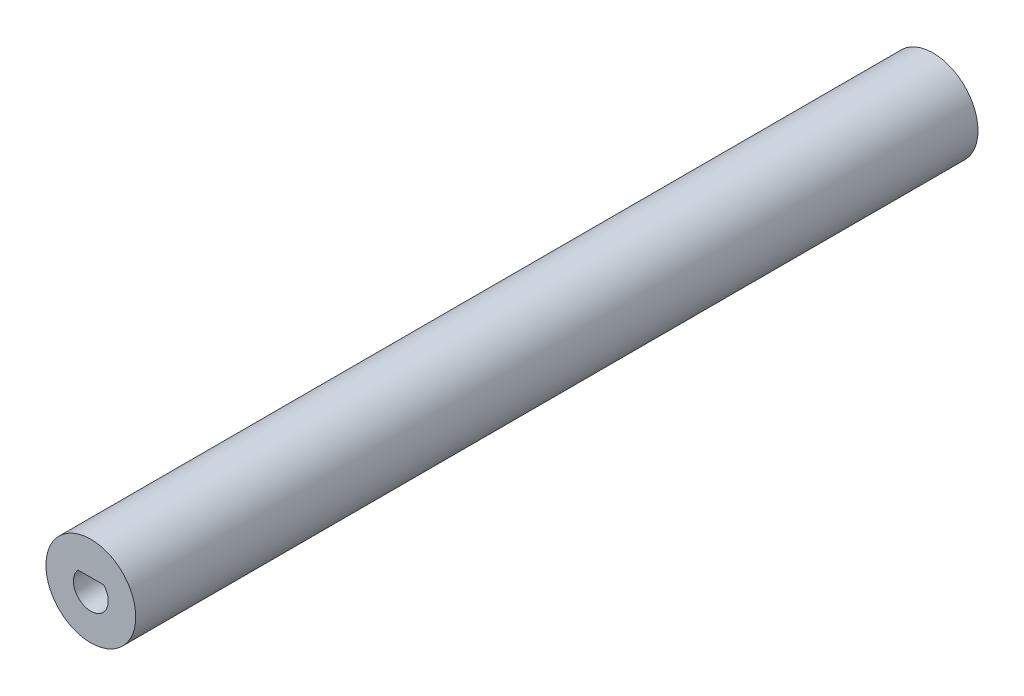
ISO-10303-21;
HEADER;
FILE_DESCRIPTION(('STEP AP214'),'2;1');
FILE_NAME('part.step','',(''),(''),'','','');
FILE_SCHEMA(('AUTOMOTIVE_DESIGN { 1 0 10303 214 1 1 1 1 }'));
ENDSEC;
DATA;
#1=APPLICATION_CONTEXT('core data for automotive mechanical design processes');
#2=APPLICATION_PROTOCOL_DEFINITION('international standard','automotive_design',2000,#1);
#3=PRODUCT_CONTEXT('',#1,'mechanical');
#4=PRODUCT('Part','Part','',(#3));
#5=PRODUCT_RELATED_PRODUCT_CATEGORY('part','',(#4));
#6=PRODUCT_DEFINITION_FORMATION('','',#4);
#7=PRODUCT_DEFINITION_CONTEXT('part definition',#1,'design');
#8=PRODUCT_DEFINITION('design','',#6,#7);
#9=PRODUCT_DEFINITION_SHAPE('','',#8);
#10=(LENGTH_UNIT() NAMED_UNIT(*) SI_UNIT(.MILLI.,.METRE.));
#11=(NAMED_UNIT(*) PLANE_ANGLE_UNIT() SI_UNIT($,.RADIAN.));
#12=(NAMED_UNIT(*) SI_UNIT($,.STERADIAN.) SOLID_ANGLE_UNIT());
#13=UNCERTAINTY_MEASURE_WITH_UNIT(LENGTH_MEASURE(1.E-05),#10,'distance_accuracy_value','');
#14=(GEOMETRIC_REPRESENTATION_CONTEXT(3) GLOBAL_UNCERTAINTY_ASSIGNED_CONTEXT((#13)) GLOBAL_UNIT_ASSIGNED_CONTEXT((#10,
#11,#12)) REPRESENTATION_CONTEXT('',''));
#15=CARTESIAN_POINT('',(0.,0.,0.));
#16=DIRECTION('',(0.,0.,1.));
#17=DIRECTION('',(1.,0.,0.));
#18=AXIS2_PLACEMENT_3D('',#15,#16,#17);
#19=CARTESIAN_POINT('',(0.,0.,75.));
#20=DIRECTION('',(0.,0.,-1.));
#21=DIRECTION('',(-1.,0.,0.));
#22=AXIS2_PLACEMENT_3D('',#19,#20,#21);
#23=CYLINDRICAL_SURFACE('',#22,4.);
#24=CARTESIAN_POINT('',(0.,0.,75.));
#25=DIRECTION('',(0.,0.,1.));
#26=DIRECTION('',(1.,0.,0.));
#27=AXIS2_PLACEMENT_3D('',#24,#25,#26);
#28=CIRCLE('',#27,4.);
#29=CARTESIAN_POINT('',(4.,0.,75.));
#30=VERTEX_POINT('',#29);
#31=EDGE_CURVE('E85',#30,#30,#28,.T.);
#32=ORIENTED_EDGE('',*,*,#31,.F.);
#33=EDGE_LOOP('',(#32));
#34=FACE_BOUND('',#33,.T.);
#35=CARTESIAN_POINT('',(0.,0.,0.));
#36=DIRECTION('',(0.,0.,1.));
#37=DIRECTION('',(1.,0.,0.));
#38=AXIS2_PLACEMENT_3D('',#35,#36,#37);
#39=CIRCLE('',#38,4.);
#40=CARTESIAN_POINT('',(4.,0.,0.));
#41=VERTEX_POINT('',#40);
#42=EDGE_CURVE('E69',#41,#41,#39,.T.);
#43=ORIENTED_EDGE('',*,*,#42,.T.);
#44=EDGE_LOOP('',(#43));
#45=FACE_BOUND('',#44,.T.);
#46=ADVANCED_FACE('F39',(#34,#45),#23,.T.);
#47=CARTESIAN_POINT('',(0.,0.,75.));
#48=DIRECTION('',(0.,0.,1.));
#49=DIRECTION('',(1.,0.,0.));
#50=AXIS2_PLACEMENT_3D('',#47,#48,#49);
#51=PLANE('',#50);
#52=CARTESIAN_POINT('',(0.,0.,75.));
#53=DIRECTION('',(0.,0.,1.));
#54=DIRECTION('',(1.,0.,0.));
#55=AXIS2_PLACEMENT_3D('',#52,#53,#54);
#56=CIRCLE('',#55,1.55);
#57=CARTESIAN_POINT('',(-1.14017542509914,1.05,75.));
#58=VERTEX_POINT('',#57);
#59=CARTESIAN_POINT('',(1.14017542509914,1.05,75.));
#60=VERTEX_POINT('',#59);
#61=EDGE_CURVE('E54',#58,#60,#56,.T.);
#62=ORIENTED_EDGE('',*,*,#61,.F.);
#63=DIRECTION('',(-1.,0.,0.));
#64=VECTOR('',#63,1.);
#65=CARTESIAN_POINT('',(-1.14017542509914,1.05,75.));
#66=LINE('',#65,#64);
#67=EDGE_CURVE('E73',#60,#58,#66,.T.);
#68=ORIENTED_EDGE('',*,*,#67,.F.);
#69=EDGE_LOOP('',(#62,#68));
#70=FACE_BOUND('',#69,.T.);
#71=ORIENTED_EDGE('',*,*,#31,.T.);
#72=EDGE_LOOP('',(#71));
#73=FACE_BOUND('',#72,.T.);
#74=ADVANCED_FACE('F78',(#70,#73),#51,.T.);
#75=CARTESIAN_POINT('',(0.,0.,0.));
#76=DIRECTION('',(0.,0.,1.));
#77=DIRECTION('',(1.,0.,0.));
#78=AXIS2_PLACEMENT_3D('',#75,#76,#77);
#79=PLANE('',#78);
#80=DIRECTION('',(-1.,0.,0.));
#81=VECTOR('',#80,1.);
#82=CARTESIAN_POINT('',(0.,1.05,0.));
#83=LINE('',#82,#81);
#84=CARTESIAN_POINT('',(1.14017542509914,1.05,0.));
#85=VERTEX_POINT('',#84);
#86=CARTESIAN_POINT('',(-1.14017542509914,1.05,0.));
#87=VERTEX_POINT('',#86);
#88=EDGE_CURVE('E47',#85,#87,#83,.T.);
#89=ORIENTED_EDGE('',*,*,#88,.T.);
#90=CARTESIAN_POINT('',(0.,0.,0.));
#91=DIRECTION('',(0.,0.,1.));
#92=DIRECTION('',(1.,0.,0.));
#93=AXIS2_PLACEMENT_3D('',#90,#91,#92);
#94=CIRCLE('',#93,1.55);
#95=EDGE_CURVE('E11',#87,#85,#94,.T.);
#96=ORIENTED_EDGE('',*,*,#95,.T.);
#97=EDGE_LOOP('',(#89,#96));
#98=FACE_BOUND('',#97,.T.);
#99=ORIENTED_EDGE('',*,*,#42,.F.);
#100=EDGE_LOOP('',(#99));
#101=FACE_BOUND('',#100,.T.);
#102=ADVANCED_FACE('F93',(#98,#101),#79,.F.);
#103=CARTESIAN_POINT('',(0.,0.,-29.));
#104=DIRECTION('',(0.,0.,1.));
#105=DIRECTION('',(1.,0.,0.));
#106=AXIS2_PLACEMENT_3D('',#103,#104,#105);
#107=CYLINDRICAL_SURFACE('',#106,1.55);
#108=DIRECTION('',(0.,0.,1.));
#109=VECTOR('',#108,1.);
#110=CARTESIAN_POINT('',(-1.14017542509914,1.05,-29.));
#111=LINE('',#110,#109);
#112=EDGE_CURVE('E61',#87,#58,#111,.T.);
#113=ORIENTED_EDGE('',*,*,#112,.T.);
#114=ORIENTED_EDGE('',*,*,#61,.T.);
#115=DIRECTION('',(0.,0.,1.));
#116=VECTOR('',#115,1.);
#117=CARTESIAN_POINT('',(1.14017542509914,1.05,-29.));
#118=LINE('',#117,#116);
#119=EDGE_CURVE('E70',#85,#60,#118,.T.);
#120=ORIENTED_EDGE('',*,*,#119,.F.);
#121=ORIENTED_EDGE('',*,*,#95,.F.);
#122=EDGE_LOOP('',(#113,#114,#120,#121));
#123=FACE_BOUND('',#122,.T.);
#124=ADVANCED_FACE('F66',(#123),#107,.F.);
#125=CARTESIAN_POINT('',(-1.14017542509914,1.05,-29.));
#126=DIRECTION('',(0.,1.,0.));
#127=DIRECTION('',(0.,0.,1.));
#128=AXIS2_PLACEMENT_3D('',#125,#126,#127);
#129=PLANE('',#128);
#130=ORIENTED_EDGE('',*,*,#119,.T.);
#131=ORIENTED_EDGE('',*,*,#67,.T.);
#132=ORIENTED_EDGE('',*,*,#112,.F.);
#133=ORIENTED_EDGE('',*,*,#88,.F.);
#134=EDGE_LOOP('',(#130,#131,#132,#133));
#135=FACE_BOUND('',#134,.T.);
#136=ADVANCED_FACE('F74',(#135),#129,.F.);
#137=CLOSED_SHELL('',(#46,#74,#102,#124,#136));
#138=MANIFOLD_SOLID_BREP('B2',#137);
#139=ADVANCED_BREP_SHAPE_REPRESENTATION('',(#18,#138),#14);
#140=SHAPE_DEFINITION_REPRESENTATION(#9,#139);
ENDSEC;
END-ISO-10303-21;
